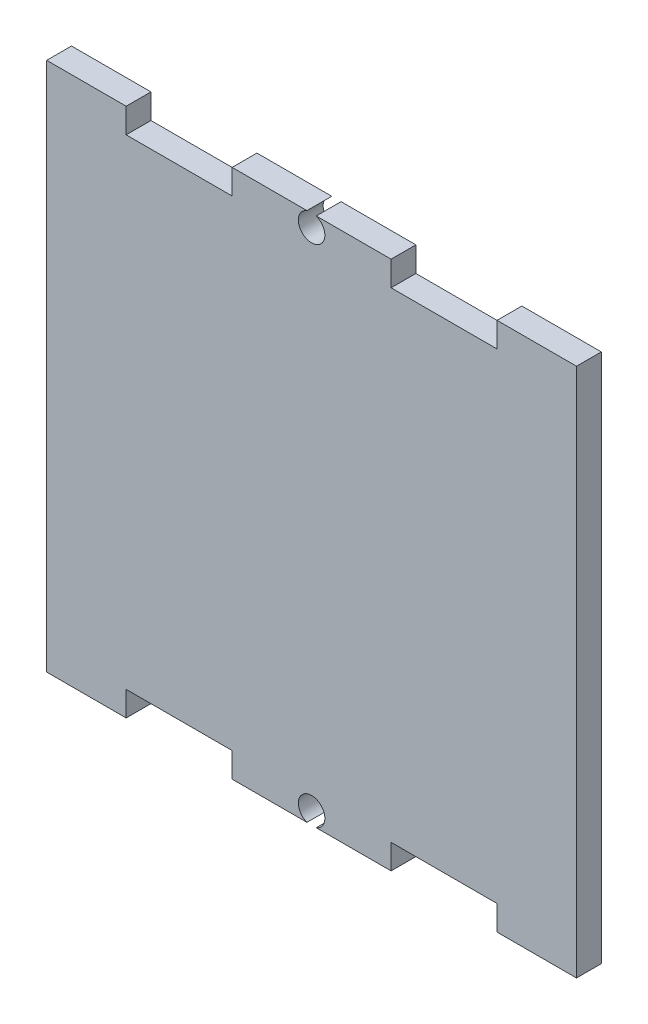
ISO-10303-21;
HEADER;
FILE_DESCRIPTION(('STEP AP214'),'2;1');
FILE_NAME('part.step','',(''),(''),'','','');
FILE_SCHEMA(('AUTOMOTIVE_DESIGN { 1 0 10303 214 1 1 1 1 }'));
ENDSEC;
DATA;
#1=APPLICATION_CONTEXT('core data for automotive mechanical design processes');
#2=APPLICATION_PROTOCOL_DEFINITION('international standard','automotive_design',2000,#1);
#3=PRODUCT_CONTEXT('',#1,'mechanical');
#4=PRODUCT('Part','Part','',(#3));
#5=PRODUCT_RELATED_PRODUCT_CATEGORY('part','',(#4));
#6=PRODUCT_DEFINITION_FORMATION('','',#4);
#7=PRODUCT_DEFINITION_CONTEXT('part definition',#1,'design');
#8=PRODUCT_DEFINITION('design','',#6,#7);
#9=PRODUCT_DEFINITION_SHAPE('','',#8);
#10=(LENGTH_UNIT() NAMED_UNIT(*) SI_UNIT(.MILLI.,.METRE.));
#11=(NAMED_UNIT(*) PLANE_ANGLE_UNIT() SI_UNIT($,.RADIAN.));
#12=(NAMED_UNIT(*) SI_UNIT($,.STERADIAN.) SOLID_ANGLE_UNIT());
#13=UNCERTAINTY_MEASURE_WITH_UNIT(LENGTH_MEASURE(1.E-05),#10,'distance_accuracy_value','');
#14=(GEOMETRIC_REPRESENTATION_CONTEXT(3) GLOBAL_UNCERTAINTY_ASSIGNED_CONTEXT((#13)) GLOBAL_UNIT_ASSIGNED_CONTEXT((#10,
#11,#12)) REPRESENTATION_CONTEXT('',''));
#15=CARTESIAN_POINT('',(0.,0.,0.));
#16=DIRECTION('',(0.,0.,1.));
#17=DIRECTION('',(1.,0.,0.));
#18=AXIS2_PLACEMENT_3D('',#15,#16,#17);
#19=CARTESIAN_POINT('',(-31.75,31.75,2.9718));
#20=DIRECTION('',(0.,-1.,0.));
#21=DIRECTION('',(0.,0.,-1.));
#22=AXIS2_PLACEMENT_3D('',#19,#20,#21);
#23=PLANE('',#22);
#24=DIRECTION('',(-1.,0.,0.));
#25=VECTOR('',#24,1.);
#26=CARTESIAN_POINT('',(-31.75,31.75,0.));
#27=LINE('',#26,#25);
#28=CARTESIAN_POINT('',(-0.5588,31.75,0.));
#29=VERTEX_POINT('',#28);
#30=CARTESIAN_POINT('',(-9.525,31.75,0.));
#31=VERTEX_POINT('',#30);
#32=EDGE_CURVE('E653',#29,#31,#27,.T.);
#33=ORIENTED_EDGE('',*,*,#32,.T.);
#34=DIRECTION('',(0.,0.,1.));
#35=VECTOR('',#34,1.);
#36=CARTESIAN_POINT('',(-9.525,31.75,0.));
#37=LINE('',#36,#35);
#38=CARTESIAN_POINT('',(-9.525,31.75,2.9718));
#39=VERTEX_POINT('',#38);
#40=EDGE_CURVE('E308',#31,#39,#37,.T.);
#41=ORIENTED_EDGE('',*,*,#40,.T.);
#42=DIRECTION('',(-1.,0.,0.));
#43=VECTOR('',#42,1.);
#44=CARTESIAN_POINT('',(-31.75,31.75,2.9718));
#45=LINE('',#44,#43);
#46=CARTESIAN_POINT('',(-0.5588,31.75,2.9718));
#47=VERTEX_POINT('',#46);
#48=EDGE_CURVE('E379',#47,#39,#45,.T.);
#49=ORIENTED_EDGE('',*,*,#48,.F.);
#50=DIRECTION('',(0.,0.,1.));
#51=VECTOR('',#50,1.);
#52=CARTESIAN_POINT('',(-0.5588,31.75,0.));
#53=LINE('',#52,#51);
#54=EDGE_CURVE('E261',#47,#29,#53,.F.);
#55=ORIENTED_EDGE('',*,*,#54,.T.);
#56=EDGE_LOOP('',(#33,#41,#49,#55));
#57=FACE_BOUND('',#56,.T.);
#58=ADVANCED_FACE('F33',(#57),#23,.F.);
#59=CARTESIAN_POINT('',(9.52500000000001,31.75,2.9718));
#60=VERTEX_POINT('',#59);
#61=CARTESIAN_POINT('',(0.5588,31.75,2.9718));
#62=VERTEX_POINT('',#61);
#63=EDGE_CURVE('E257',#60,#62,#45,.T.);
#64=ORIENTED_EDGE('',*,*,#63,.F.);
#65=DIRECTION('',(0.,0.,1.));
#66=VECTOR('',#65,1.);
#67=CARTESIAN_POINT('',(9.52500000000001,31.75,0.));
#68=LINE('',#67,#66);
#69=CARTESIAN_POINT('',(9.52500000000001,31.75,0.));
#70=VERTEX_POINT('',#69);
#71=EDGE_CURVE('E281',#70,#60,#68,.T.);
#72=ORIENTED_EDGE('',*,*,#71,.F.);
#73=CARTESIAN_POINT('',(0.5588,31.75,0.));
#74=VERTEX_POINT('',#73);
#75=EDGE_CURVE('E240',#70,#74,#27,.T.);
#76=ORIENTED_EDGE('',*,*,#75,.T.);
#77=DIRECTION('',(0.,0.,1.));
#78=VECTOR('',#77,1.);
#79=CARTESIAN_POINT('',(0.5588,31.75,0.));
#80=LINE('',#79,#78);
#81=EDGE_CURVE('E247',#74,#62,#80,.T.);
#82=ORIENTED_EDGE('',*,*,#81,.T.);
#83=EDGE_LOOP('',(#64,#72,#76,#82));
#84=FACE_BOUND('',#83,.T.);
#85=ADVANCED_FACE('F373',(#84),#23,.F.);
#86=CARTESIAN_POINT('',(31.75,31.75,0.));
#87=VERTEX_POINT('',#86);
#88=CARTESIAN_POINT('',(22.225,31.75,0.));
#89=VERTEX_POINT('',#88);
#90=EDGE_CURVE('E236',#87,#89,#27,.T.);
#91=ORIENTED_EDGE('',*,*,#90,.T.);
#92=DIRECTION('',(0.,0.,1.));
#93=VECTOR('',#92,1.);
#94=CARTESIAN_POINT('',(22.225,31.75,0.));
#95=LINE('',#94,#93);
#96=CARTESIAN_POINT('',(22.225,31.75,2.9718));
#97=VERTEX_POINT('',#96);
#98=EDGE_CURVE('E278',#89,#97,#95,.T.);
#99=ORIENTED_EDGE('',*,*,#98,.T.);
#100=CARTESIAN_POINT('',(31.75,31.75,2.9718));
#101=VERTEX_POINT('',#100);
#102=EDGE_CURVE('E255',#101,#97,#45,.T.);
#103=ORIENTED_EDGE('',*,*,#102,.F.);
#104=DIRECTION('',(0.,0.,-1.));
#105=VECTOR('',#104,1.);
#106=CARTESIAN_POINT('',(31.75,31.75,2.9718));
#107=LINE('',#106,#105);
#108=EDGE_CURVE('E391',#101,#87,#107,.T.);
#109=ORIENTED_EDGE('',*,*,#108,.T.);
#110=EDGE_LOOP('',(#91,#99,#103,#109));
#111=FACE_BOUND('',#110,.T.);
#112=ADVANCED_FACE('F417',(#111),#23,.F.);
#113=CARTESIAN_POINT('',(-31.75,-31.75,2.9718));
#114=DIRECTION('',(0.,1.,0.));
#115=DIRECTION('',(0.,0.,1.));
#116=AXIS2_PLACEMENT_3D('',#113,#114,#115);
#117=PLANE('',#116);
#118=DIRECTION('',(1.,0.,0.));
#119=VECTOR('',#118,1.);
#120=CARTESIAN_POINT('',(-31.75,-31.75,0.));
#121=LINE('',#120,#119);
#122=CARTESIAN_POINT('',(-31.75,-31.75,0.));
#123=VERTEX_POINT('',#122);
#124=CARTESIAN_POINT('',(-22.225,-31.75,0.));
#125=VERTEX_POINT('',#124);
#126=EDGE_CURVE('E209',#123,#125,#121,.T.);
#127=ORIENTED_EDGE('',*,*,#126,.T.);
#128=DIRECTION('',(0.,0.,1.));
#129=VECTOR('',#128,1.);
#130=CARTESIAN_POINT('',(-22.225,-31.75,0.));
#131=LINE('',#130,#129);
#132=CARTESIAN_POINT('',(-22.225,-31.75,2.9718));
#133=VERTEX_POINT('',#132);
#134=EDGE_CURVE('E193',#125,#133,#131,.T.);
#135=ORIENTED_EDGE('',*,*,#134,.T.);
#136=DIRECTION('',(1.,0.,0.));
#137=VECTOR('',#136,1.);
#138=CARTESIAN_POINT('',(-31.75,-31.75,2.9718));
#139=LINE('',#138,#137);
#140=CARTESIAN_POINT('',(-31.75,-31.75,2.9718));
#141=VERTEX_POINT('',#140);
#142=EDGE_CURVE('E248',#141,#133,#139,.T.);
#143=ORIENTED_EDGE('',*,*,#142,.F.);
#144=DIRECTION('',(0.,0.,-1.));
#145=VECTOR('',#144,1.);
#146=CARTESIAN_POINT('',(-31.75,-31.75,2.9718));
#147=LINE('',#146,#145);
#148=EDGE_CURVE('E217',#141,#123,#147,.T.);
#149=ORIENTED_EDGE('',*,*,#148,.T.);
#150=EDGE_LOOP('',(#127,#135,#143,#149));
#151=FACE_BOUND('',#150,.T.);
#152=ADVANCED_FACE('F215',(#151),#117,.F.);
#153=CARTESIAN_POINT('',(0.5588,-31.75,0.));
#154=VERTEX_POINT('',#153);
#155=CARTESIAN_POINT('',(9.52500000000001,-31.75,0.));
#156=VERTEX_POINT('',#155);
#157=EDGE_CURVE('E226',#154,#156,#121,.T.);
#158=ORIENTED_EDGE('',*,*,#157,.T.);
#159=DIRECTION('',(0.,0.,1.));
#160=VECTOR('',#159,1.);
#161=CARTESIAN_POINT('',(9.52500000000001,-31.75,0.));
#162=LINE('',#161,#160);
#163=CARTESIAN_POINT('',(9.52500000000001,-31.75,2.9718));
#164=VERTEX_POINT('',#163);
#165=EDGE_CURVE('E334',#156,#164,#162,.T.);
#166=ORIENTED_EDGE('',*,*,#165,.T.);
#167=CARTESIAN_POINT('',(0.5588,-31.75,2.9718));
#168=VERTEX_POINT('',#167);
#169=EDGE_CURVE('E421',#168,#164,#139,.T.);
#170=ORIENTED_EDGE('',*,*,#169,.F.);
#171=DIRECTION('',(0.,0.,1.));
#172=VECTOR('',#171,1.);
#173=CARTESIAN_POINT('',(0.5588,-31.75,0.));
#174=LINE('',#173,#172);
#175=EDGE_CURVE('E267',#168,#154,#174,.F.);
#176=ORIENTED_EDGE('',*,*,#175,.T.);
#177=EDGE_LOOP('',(#158,#166,#170,#176));
#178=FACE_BOUND('',#177,.T.);
#179=ADVANCED_FACE('F427',(#178),#117,.F.);
#180=CARTESIAN_POINT('',(-9.525,-31.75,2.9718));
#181=VERTEX_POINT('',#180);
#182=CARTESIAN_POINT('',(-0.5588,-31.75,2.9718));
#183=VERTEX_POINT('',#182);
#184=EDGE_CURVE('E251',#181,#183,#139,.T.);
#185=ORIENTED_EDGE('',*,*,#184,.F.);
#186=DIRECTION('',(0.,0.,1.));
#187=VECTOR('',#186,1.);
#188=CARTESIAN_POINT('',(-9.525,-31.75,0.));
#189=LINE('',#188,#187);
#190=CARTESIAN_POINT('',(-9.525,-31.75,0.));
#191=VERTEX_POINT('',#190);
#192=EDGE_CURVE('E203',#191,#181,#189,.T.);
#193=ORIENTED_EDGE('',*,*,#192,.F.);
#194=CARTESIAN_POINT('',(-0.5588,-31.75,0.));
#195=VERTEX_POINT('',#194);
#196=EDGE_CURVE('E219',#191,#195,#121,.T.);
#197=ORIENTED_EDGE('',*,*,#196,.T.);
#198=DIRECTION('',(0.,0.,1.));
#199=VECTOR('',#198,1.);
#200=CARTESIAN_POINT('',(-0.5588,-31.75,0.));
#201=LINE('',#200,#199);
#202=EDGE_CURVE('E264',#195,#183,#201,.T.);
#203=ORIENTED_EDGE('',*,*,#202,.T.);
#204=EDGE_LOOP('',(#185,#193,#197,#203));
#205=FACE_BOUND('',#204,.T.);
#206=ADVANCED_FACE('F405',(#205),#117,.F.);
#207=CARTESIAN_POINT('',(31.75,-31.75,2.9718));
#208=DIRECTION('',(-1.,0.,0.));
#209=DIRECTION('',(0.,0.,1.));
#210=AXIS2_PLACEMENT_3D('',#207,#208,#209);
#211=PLANE('',#210);
#212=DIRECTION('',(0.,1.,0.));
#213=VECTOR('',#212,1.);
#214=CARTESIAN_POINT('',(31.75,-31.75,0.));
#215=LINE('',#214,#213);
#216=CARTESIAN_POINT('',(31.75,-31.75,0.));
#217=VERTEX_POINT('',#216);
#218=EDGE_CURVE('E244',#217,#87,#215,.T.);
#219=ORIENTED_EDGE('',*,*,#218,.T.);
#220=ORIENTED_EDGE('',*,*,#108,.F.);
#221=DIRECTION('',(0.,1.,0.));
#222=VECTOR('',#221,1.);
#223=CARTESIAN_POINT('',(31.75,-31.75,2.9718));
#224=LINE('',#223,#222);
#225=CARTESIAN_POINT('',(31.75,-31.75,2.9718));
#226=VERTEX_POINT('',#225);
#227=EDGE_CURVE('E218',#226,#101,#224,.T.);
#228=ORIENTED_EDGE('',*,*,#227,.F.);
#229=DIRECTION('',(0.,0.,-1.));
#230=VECTOR('',#229,1.);
#231=CARTESIAN_POINT('',(31.75,-31.75,2.9718));
#232=LINE('',#231,#230);
#233=EDGE_CURVE('E250',#226,#217,#232,.T.);
#234=ORIENTED_EDGE('',*,*,#233,.T.);
#235=EDGE_LOOP('',(#219,#220,#228,#234));
#236=FACE_BOUND('',#235,.T.);
#237=ADVANCED_FACE('F35',(#236),#211,.F.);
#238=CARTESIAN_POINT('',(-22.225,31.75,2.9718));
#239=VERTEX_POINT('',#238);
#240=CARTESIAN_POINT('',(-31.75,31.75,2.9718));
#241=VERTEX_POINT('',#240);
#242=EDGE_CURVE('E223',#239,#241,#45,.T.);
#243=ORIENTED_EDGE('',*,*,#242,.F.);
#244=DIRECTION('',(0.,0.,1.));
#245=VECTOR('',#244,1.);
#246=CARTESIAN_POINT('',(-22.225,31.75,0.));
#247=LINE('',#246,#245);
#248=CARTESIAN_POINT('',(-22.225,31.75,0.));
#249=VERTEX_POINT('',#248);
#250=EDGE_CURVE('E301',#249,#239,#247,.T.);
#251=ORIENTED_EDGE('',*,*,#250,.F.);
#252=CARTESIAN_POINT('',(-31.75,31.75,0.));
#253=VERTEX_POINT('',#252);
#254=EDGE_CURVE('E242',#249,#253,#27,.T.);
#255=ORIENTED_EDGE('',*,*,#254,.T.);
#256=DIRECTION('',(0.,0.,-1.));
#257=VECTOR('',#256,1.);
#258=CARTESIAN_POINT('',(-31.75,31.75,2.9718));
#259=LINE('',#258,#257);
#260=EDGE_CURVE('E388',#241,#253,#259,.T.);
#261=ORIENTED_EDGE('',*,*,#260,.F.);
#262=EDGE_LOOP('',(#243,#251,#255,#261));
#263=FACE_BOUND('',#262,.T.);
#264=ADVANCED_FACE('F389',(#263),#23,.F.);
#265=CARTESIAN_POINT('',(-31.75,-31.75,2.9718));
#266=DIRECTION('',(1.,0.,0.));
#267=DIRECTION('',(0.,0.,-1.));
#268=AXIS2_PLACEMENT_3D('',#265,#266,#267);
#269=PLANE('',#268);
#270=DIRECTION('',(0.,-1.,0.));
#271=VECTOR('',#270,1.);
#272=CARTESIAN_POINT('',(-31.75,-31.75,0.));
#273=LINE('',#272,#271);
#274=EDGE_CURVE('E229',#253,#123,#273,.T.);
#275=ORIENTED_EDGE('',*,*,#274,.T.);
#276=ORIENTED_EDGE('',*,*,#148,.F.);
#277=DIRECTION('',(0.,-1.,0.));
#278=VECTOR('',#277,1.);
#279=CARTESIAN_POINT('',(-31.75,-31.75,2.9718));
#280=LINE('',#279,#278);
#281=EDGE_CURVE('E253',#241,#141,#280,.T.);
#282=ORIENTED_EDGE('',*,*,#281,.F.);
#283=ORIENTED_EDGE('',*,*,#260,.T.);
#284=EDGE_LOOP('',(#275,#276,#282,#283));
#285=FACE_BOUND('',#284,.T.);
#286=ADVANCED_FACE('F393',(#285),#269,.F.);
#287=CARTESIAN_POINT('',(22.225,-31.75,2.9718));
#288=VERTEX_POINT('',#287);
#289=EDGE_CURVE('E252',#288,#226,#139,.T.);
#290=ORIENTED_EDGE('',*,*,#289,.F.);
#291=DIRECTION('',(0.,0.,1.));
#292=VECTOR('',#291,1.);
#293=CARTESIAN_POINT('',(22.225,-31.75,0.));
#294=LINE('',#293,#292);
#295=CARTESIAN_POINT('',(22.225,-31.75,0.));
#296=VERTEX_POINT('',#295);
#297=EDGE_CURVE('E327',#296,#288,#294,.T.);
#298=ORIENTED_EDGE('',*,*,#297,.F.);
#299=EDGE_CURVE('E221',#296,#217,#121,.T.);
#300=ORIENTED_EDGE('',*,*,#299,.T.);
#301=ORIENTED_EDGE('',*,*,#233,.F.);
#302=EDGE_LOOP('',(#290,#298,#300,#301));
#303=FACE_BOUND('',#302,.T.);
#304=ADVANCED_FACE('F433',(#303),#117,.F.);
#305=CARTESIAN_POINT('',(0.,0.,2.9718));
#306=DIRECTION('',(0.,0.,-1.));
#307=DIRECTION('',(-1.,0.,0.));
#308=AXIS2_PLACEMENT_3D('',#305,#306,#307);
#309=PLANE('',#308);
#310=ORIENTED_EDGE('',*,*,#142,.T.);
#311=DIRECTION('',(0.,-1.,0.));
#312=VECTOR('',#311,1.);
#313=CARTESIAN_POINT('',(-22.225,-31.75,2.9718));
#314=LINE('',#313,#312);
#315=CARTESIAN_POINT('',(-22.225,-28.7782,2.9718));
#316=VERTEX_POINT('',#315);
#317=EDGE_CURVE('E198',#316,#133,#314,.T.);
#318=ORIENTED_EDGE('',*,*,#317,.F.);
#319=DIRECTION('',(-1.,0.,0.));
#320=VECTOR('',#319,1.);
#321=CARTESIAN_POINT('',(-22.225,-28.7782,2.9718));
#322=LINE('',#321,#320);
#323=CARTESIAN_POINT('',(-9.525,-28.7782,2.9718));
#324=VERTEX_POINT('',#323);
#325=EDGE_CURVE('E212',#324,#316,#322,.T.);
#326=ORIENTED_EDGE('',*,*,#325,.F.);
#327=DIRECTION('',(0.,1.,0.));
#328=VECTOR('',#327,1.);
#329=CARTESIAN_POINT('',(-9.525,-31.75,2.9718));
#330=LINE('',#329,#328);
#331=EDGE_CURVE('E356',#181,#324,#330,.T.);
#332=ORIENTED_EDGE('',*,*,#331,.F.);
#333=ORIENTED_EDGE('',*,*,#184,.T.);
#334=CARTESIAN_POINT('',(0.,-30.2641,2.9718));
#335=DIRECTION('',(0.,0.,1.));
#336=DIRECTION('',(1.,0.,0.));
#337=AXIS2_PLACEMENT_3D('',#334,#335,#336);
#338=CIRCLE('',#337,1.5875);
#339=EDGE_CURVE('E270',#168,#183,#338,.T.);
#340=ORIENTED_EDGE('',*,*,#339,.F.);
#341=ORIENTED_EDGE('',*,*,#169,.T.);
#342=DIRECTION('',(0.,-1.,0.));
#343=VECTOR('',#342,1.);
#344=CARTESIAN_POINT('',(9.52500000000001,-31.75,2.9718));
#345=LINE('',#344,#343);
#346=CARTESIAN_POINT('',(9.52500000000001,-28.7782,2.9718));
#347=VERTEX_POINT('',#346);
#348=EDGE_CURVE('E337',#347,#164,#345,.T.);
#349=ORIENTED_EDGE('',*,*,#348,.F.);
#350=DIRECTION('',(-1.,0.,0.));
#351=VECTOR('',#350,1.);
#352=CARTESIAN_POINT('',(9.52500000000001,-28.7782,2.9718));
#353=LINE('',#352,#351);
#354=CARTESIAN_POINT('',(22.225,-28.7782,2.9718));
#355=VERTEX_POINT('',#354);
#356=EDGE_CURVE('E340',#355,#347,#353,.T.);
#357=ORIENTED_EDGE('',*,*,#356,.F.);
#358=DIRECTION('',(0.,1.,0.));
#359=VECTOR('',#358,1.);
#360=CARTESIAN_POINT('',(22.225,-31.75,2.9718));
#361=LINE('',#360,#359);
#362=EDGE_CURVE('E311',#288,#355,#361,.T.);
#363=ORIENTED_EDGE('',*,*,#362,.F.);
#364=ORIENTED_EDGE('',*,*,#289,.T.);
#365=ORIENTED_EDGE('',*,*,#227,.T.);
#366=ORIENTED_EDGE('',*,*,#102,.T.);
#367=DIRECTION('',(0.,1.,0.));
#368=VECTOR('',#367,1.);
#369=CARTESIAN_POINT('',(22.225,31.75,2.9718));
#370=LINE('',#369,#368);
#371=CARTESIAN_POINT('',(22.225,28.7782,2.9718));
#372=VERTEX_POINT('',#371);
#373=EDGE_CURVE('E284',#372,#97,#370,.T.);
#374=ORIENTED_EDGE('',*,*,#373,.F.);
#375=DIRECTION('',(1.,0.,0.));
#376=VECTOR('',#375,1.);
#377=CARTESIAN_POINT('',(9.52500000000001,28.7782,2.9718));
#378=LINE('',#377,#376);
#379=CARTESIAN_POINT('',(9.52500000000001,28.7782,2.9718));
#380=VERTEX_POINT('',#379);
#381=EDGE_CURVE('E287',#380,#372,#378,.T.);
#382=ORIENTED_EDGE('',*,*,#381,.F.);
#383=DIRECTION('',(0.,-1.,0.));
#384=VECTOR('',#383,1.);
#385=CARTESIAN_POINT('',(9.52500000000001,31.75,2.9718));
#386=LINE('',#385,#384);
#387=EDGE_CURVE('E290',#60,#380,#386,.T.);
#388=ORIENTED_EDGE('',*,*,#387,.F.);
#389=ORIENTED_EDGE('',*,*,#63,.T.);
#390=CARTESIAN_POINT('',(0.,30.2641,2.9718));
#391=DIRECTION('',(0.,0.,1.));
#392=DIRECTION('',(-1.,0.,0.));
#393=AXIS2_PLACEMENT_3D('',#390,#391,#392);
#394=CIRCLE('',#393,1.5875);
#395=EDGE_CURVE('E293',#47,#62,#394,.T.);
#396=ORIENTED_EDGE('',*,*,#395,.F.);
#397=ORIENTED_EDGE('',*,*,#48,.T.);
#398=DIRECTION('',(0.,1.,0.));
#399=VECTOR('',#398,1.);
#400=CARTESIAN_POINT('',(-9.525,31.75,2.9718));
#401=LINE('',#400,#399);
#402=CARTESIAN_POINT('',(-9.525,28.7782,2.9718));
#403=VERTEX_POINT('',#402);
#404=EDGE_CURVE('E312',#403,#39,#401,.T.);
#405=ORIENTED_EDGE('',*,*,#404,.F.);
#406=DIRECTION('',(1.,0.,0.));
#407=VECTOR('',#406,1.);
#408=CARTESIAN_POINT('',(-22.225,28.7782,2.9718));
#409=LINE('',#408,#407);
#410=CARTESIAN_POINT('',(-22.225,28.7782,2.9718));
#411=VERTEX_POINT('',#410);
#412=EDGE_CURVE('E315',#411,#403,#409,.T.);
#413=ORIENTED_EDGE('',*,*,#412,.F.);
#414=DIRECTION('',(0.,-1.,0.));
#415=VECTOR('',#414,1.);
#416=CARTESIAN_POINT('',(-22.225,31.75,2.9718));
#417=LINE('',#416,#415);
#418=EDGE_CURVE('E283',#239,#411,#417,.T.);
#419=ORIENTED_EDGE('',*,*,#418,.F.);
#420=ORIENTED_EDGE('',*,*,#242,.T.);
#421=ORIENTED_EDGE('',*,*,#281,.T.);
#422=EDGE_LOOP('',(#310,#318,#326,#332,#333,#340,#341,#349,#357,#363,#364,#365,#366,#374,#382,
#388,#389,#396,#397,#405,#413,#419,#420,#421));
#423=FACE_BOUND('',#422,.T.);
#424=ADVANCED_FACE('F377',(#423),#309,.F.);
#425=CARTESIAN_POINT('',(0.,0.,0.));
#426=DIRECTION('',(0.,0.,-1.));
#427=DIRECTION('',(-1.,0.,0.));
#428=AXIS2_PLACEMENT_3D('',#425,#426,#427);
#429=PLANE('',#428);
#430=DIRECTION('',(0.,-1.,0.));
#431=VECTOR('',#430,1.);
#432=CARTESIAN_POINT('',(-22.225,-31.75,0.));
#433=LINE('',#432,#431);
#434=CARTESIAN_POINT('',(-22.225,-28.7782,0.));
#435=VERTEX_POINT('',#434);
#436=EDGE_CURVE('E196',#435,#125,#433,.T.);
#437=ORIENTED_EDGE('',*,*,#436,.T.);
#438=ORIENTED_EDGE('',*,*,#126,.F.);
#439=ORIENTED_EDGE('',*,*,#274,.F.);
#440=ORIENTED_EDGE('',*,*,#254,.F.);
#441=DIRECTION('',(0.,-1.,0.));
#442=VECTOR('',#441,1.);
#443=CARTESIAN_POINT('',(-22.225,31.75,0.));
#444=LINE('',#443,#442);
#445=CARTESIAN_POINT('',(-22.225,28.7782,0.));
#446=VERTEX_POINT('',#445);
#447=EDGE_CURVE('E314',#249,#446,#444,.T.);
#448=ORIENTED_EDGE('',*,*,#447,.T.);
#449=DIRECTION('',(1.,0.,0.));
#450=VECTOR('',#449,1.);
#451=CARTESIAN_POINT('',(-22.225,28.7782,0.));
#452=LINE('',#451,#450);
#453=CARTESIAN_POINT('',(-9.525,28.7782,0.));
#454=VERTEX_POINT('',#453);
#455=EDGE_CURVE('E322',#446,#454,#452,.T.);
#456=ORIENTED_EDGE('',*,*,#455,.T.);
#457=DIRECTION('',(0.,1.,0.));
#458=VECTOR('',#457,1.);
#459=CARTESIAN_POINT('',(-9.525,31.75,0.));
#460=LINE('',#459,#458);
#461=EDGE_CURVE('E304',#454,#31,#460,.T.);
#462=ORIENTED_EDGE('',*,*,#461,.T.);
#463=ORIENTED_EDGE('',*,*,#32,.F.);
#464=CARTESIAN_POINT('',(0.,30.2641,0.));
#465=DIRECTION('',(0.,0.,-1.));
#466=DIRECTION('',(-1.,0.,0.));
#467=AXIS2_PLACEMENT_3D('',#464,#465,#466);
#468=CIRCLE('',#467,1.5875);
#469=EDGE_CURVE('E11',#74,#29,#468,.T.);
#470=ORIENTED_EDGE('',*,*,#469,.F.);
#471=ORIENTED_EDGE('',*,*,#75,.F.);
#472=DIRECTION('',(0.,-1.,0.));
#473=VECTOR('',#472,1.);
#474=CARTESIAN_POINT('',(9.52500000000001,31.75,0.));
#475=LINE('',#474,#473);
#476=CARTESIAN_POINT('',(9.52500000000001,28.7782,0.));
#477=VERTEX_POINT('',#476);
#478=EDGE_CURVE('E286',#70,#477,#475,.T.);
#479=ORIENTED_EDGE('',*,*,#478,.T.);
#480=DIRECTION('',(1.,0.,0.));
#481=VECTOR('',#480,1.);
#482=CARTESIAN_POINT('',(9.52500000000001,28.7782,0.));
#483=LINE('',#482,#481);
#484=CARTESIAN_POINT('',(22.225,28.7782,0.));
#485=VERTEX_POINT('',#484);
#486=EDGE_CURVE('E296',#477,#485,#483,.T.);
#487=ORIENTED_EDGE('',*,*,#486,.T.);
#488=DIRECTION('',(0.,1.,0.));
#489=VECTOR('',#488,1.);
#490=CARTESIAN_POINT('',(22.225,31.75,0.));
#491=LINE('',#490,#489);
#492=EDGE_CURVE('E276',#485,#89,#491,.T.);
#493=ORIENTED_EDGE('',*,*,#492,.T.);
#494=ORIENTED_EDGE('',*,*,#90,.F.);
#495=ORIENTED_EDGE('',*,*,#218,.F.);
#496=ORIENTED_EDGE('',*,*,#299,.F.);
#497=DIRECTION('',(0.,1.,0.));
#498=VECTOR('',#497,1.);
#499=CARTESIAN_POINT('',(22.225,-31.75,0.));
#500=LINE('',#499,#498);
#501=CARTESIAN_POINT('',(22.225,-28.7782,0.));
#502=VERTEX_POINT('',#501);
#503=EDGE_CURVE('E339',#296,#502,#500,.T.);
#504=ORIENTED_EDGE('',*,*,#503,.T.);
#505=DIRECTION('',(-1.,0.,0.));
#506=VECTOR('',#505,1.);
#507=CARTESIAN_POINT('',(9.52500000000001,-28.7782,0.));
#508=LINE('',#507,#506);
#509=CARTESIAN_POINT('',(9.52500000000001,-28.7782,0.));
#510=VERTEX_POINT('',#509);
#511=EDGE_CURVE('E56',#502,#510,#508,.T.);
#512=ORIENTED_EDGE('',*,*,#511,.T.);
#513=DIRECTION('',(0.,-1.,0.));
#514=VECTOR('',#513,1.);
#515=CARTESIAN_POINT('',(9.52500000000001,-31.75,0.));
#516=LINE('',#515,#514);
#517=EDGE_CURVE('E330',#510,#156,#516,.T.);
#518=ORIENTED_EDGE('',*,*,#517,.T.);
#519=ORIENTED_EDGE('',*,*,#157,.F.);
#520=CARTESIAN_POINT('',(0.,-30.2641,0.));
#521=DIRECTION('',(0.,0.,-1.));
#522=DIRECTION('',(-1.,0.,0.));
#523=AXIS2_PLACEMENT_3D('',#520,#521,#522);
#524=CIRCLE('',#523,1.5875);
#525=EDGE_CURVE('E41',#195,#154,#524,.T.);
#526=ORIENTED_EDGE('',*,*,#525,.F.);
#527=ORIENTED_EDGE('',*,*,#196,.F.);
#528=DIRECTION('',(0.,1.,0.));
#529=VECTOR('',#528,1.);
#530=CARTESIAN_POINT('',(-9.525,-31.75,0.));
#531=LINE('',#530,#529);
#532=CARTESIAN_POINT('',(-9.525,-28.7782,0.));
#533=VERTEX_POINT('',#532);
#534=EDGE_CURVE('E211',#191,#533,#531,.T.);
#535=ORIENTED_EDGE('',*,*,#534,.T.);
#536=DIRECTION('',(-1.,0.,0.));
#537=VECTOR('',#536,1.);
#538=CARTESIAN_POINT('',(-22.225,-28.7782,0.));
#539=LINE('',#538,#537);
#540=EDGE_CURVE('E48',#533,#435,#539,.T.);
#541=ORIENTED_EDGE('',*,*,#540,.T.);
#542=EDGE_LOOP('',(#437,#438,#439,#440,#448,#456,#462,#463,#470,#471,#479,#487,#493,#494,#495,
#496,#504,#512,#518,#519,#526,#527,#535,#541));
#543=FACE_BOUND('',#542,.T.);
#544=ADVANCED_FACE('F207',(#543),#429,.T.);
#545=CARTESIAN_POINT('',(0.,-30.2641,0.));
#546=DIRECTION('',(0.,0.,1.));
#547=DIRECTION('',(1.,0.,0.));
#548=AXIS2_PLACEMENT_3D('',#545,#546,#547);
#549=CYLINDRICAL_SURFACE('',#548,1.5875);
#550=ORIENTED_EDGE('',*,*,#525,.T.);
#551=ORIENTED_EDGE('',*,*,#175,.F.);
#552=ORIENTED_EDGE('',*,*,#339,.T.);
#553=ORIENTED_EDGE('',*,*,#202,.F.);
#554=EDGE_LOOP('',(#550,#551,#552,#553));
#555=FACE_BOUND('',#554,.T.);
#556=ADVANCED_FACE('F512',(#555),#549,.F.);
#557=CARTESIAN_POINT('',(0.,30.2641,0.));
#558=DIRECTION('',(0.,0.,1.));
#559=DIRECTION('',(1.,0.,0.));
#560=AXIS2_PLACEMENT_3D('',#557,#558,#559);
#561=CYLINDRICAL_SURFACE('',#560,1.5875);
#562=ORIENTED_EDGE('',*,*,#469,.T.);
#563=ORIENTED_EDGE('',*,*,#54,.F.);
#564=ORIENTED_EDGE('',*,*,#395,.T.);
#565=ORIENTED_EDGE('',*,*,#81,.F.);
#566=EDGE_LOOP('',(#562,#563,#564,#565));
#567=FACE_BOUND('',#566,.T.);
#568=ADVANCED_FACE('F364',(#567),#561,.F.);
#569=CARTESIAN_POINT('',(9.52500000000001,31.75,0.));
#570=DIRECTION('',(-1.,0.,0.));
#571=DIRECTION('',(0.,0.,1.));
#572=AXIS2_PLACEMENT_3D('',#569,#570,#571);
#573=PLANE('',#572);
#574=ORIENTED_EDGE('',*,*,#387,.T.);
#575=DIRECTION('',(0.,0.,1.));
#576=VECTOR('',#575,1.);
#577=CARTESIAN_POINT('',(9.52500000000001,28.7782,0.));
#578=LINE('',#577,#576);
#579=EDGE_CURVE('E273',#477,#380,#578,.T.);
#580=ORIENTED_EDGE('',*,*,#579,.F.);
#581=ORIENTED_EDGE('',*,*,#478,.F.);
#582=ORIENTED_EDGE('',*,*,#71,.T.);
#583=EDGE_LOOP('',(#574,#580,#581,#582));
#584=FACE_BOUND('',#583,.T.);
#585=ADVANCED_FACE('F535',(#584),#573,.F.);
#586=CARTESIAN_POINT('',(22.225,31.75,0.));
#587=DIRECTION('',(1.,0.,0.));
#588=DIRECTION('',(0.,0.,-1.));
#589=AXIS2_PLACEMENT_3D('',#586,#587,#588);
#590=PLANE('',#589);
#591=ORIENTED_EDGE('',*,*,#373,.T.);
#592=ORIENTED_EDGE('',*,*,#98,.F.);
#593=ORIENTED_EDGE('',*,*,#492,.F.);
#594=DIRECTION('',(0.,0.,1.));
#595=VECTOR('',#594,1.);
#596=CARTESIAN_POINT('',(22.225,28.7782,0.));
#597=LINE('',#596,#595);
#598=EDGE_CURVE('E275',#485,#372,#597,.T.);
#599=ORIENTED_EDGE('',*,*,#598,.T.);
#600=EDGE_LOOP('',(#591,#592,#593,#599));
#601=FACE_BOUND('',#600,.T.);
#602=ADVANCED_FACE('F542',(#601),#590,.F.);
#603=CARTESIAN_POINT('',(9.52500000000001,28.7782,0.));
#604=DIRECTION('',(0.,-1.,0.));
#605=DIRECTION('',(0.,0.,-1.));
#606=AXIS2_PLACEMENT_3D('',#603,#604,#605);
#607=PLANE('',#606);
#608=ORIENTED_EDGE('',*,*,#381,.T.);
#609=ORIENTED_EDGE('',*,*,#598,.F.);
#610=ORIENTED_EDGE('',*,*,#486,.F.);
#611=ORIENTED_EDGE('',*,*,#579,.T.);
#612=EDGE_LOOP('',(#608,#609,#610,#611));
#613=FACE_BOUND('',#612,.T.);
#614=ADVANCED_FACE('F550',(#613),#607,.F.);
#615=CARTESIAN_POINT('',(-9.525,31.75,0.));
#616=DIRECTION('',(1.,0.,0.));
#617=DIRECTION('',(0.,0.,-1.));
#618=AXIS2_PLACEMENT_3D('',#615,#616,#617);
#619=PLANE('',#618);
#620=ORIENTED_EDGE('',*,*,#404,.T.);
#621=ORIENTED_EDGE('',*,*,#40,.F.);
#622=ORIENTED_EDGE('',*,*,#461,.F.);
#623=DIRECTION('',(0.,0.,1.));
#624=VECTOR('',#623,1.);
#625=CARTESIAN_POINT('',(-9.525,28.7782,0.));
#626=LINE('',#625,#624);
#627=EDGE_CURVE('E306',#454,#403,#626,.T.);
#628=ORIENTED_EDGE('',*,*,#627,.T.);
#629=EDGE_LOOP('',(#620,#621,#622,#628));
#630=FACE_BOUND('',#629,.T.);
#631=ADVANCED_FACE('F558',(#630),#619,.F.);
#632=CARTESIAN_POINT('',(-22.225,28.7782,0.));
#633=DIRECTION('',(0.,-1.,0.));
#634=DIRECTION('',(0.,0.,-1.));
#635=AXIS2_PLACEMENT_3D('',#632,#633,#634);
#636=PLANE('',#635);
#637=ORIENTED_EDGE('',*,*,#412,.T.);
#638=ORIENTED_EDGE('',*,*,#627,.F.);
#639=ORIENTED_EDGE('',*,*,#455,.F.);
#640=DIRECTION('',(0.,0.,1.));
#641=VECTOR('',#640,1.);
#642=CARTESIAN_POINT('',(-22.225,28.7782,0.));
#643=LINE('',#642,#641);
#644=EDGE_CURVE('E303',#446,#411,#643,.T.);
#645=ORIENTED_EDGE('',*,*,#644,.T.);
#646=EDGE_LOOP('',(#637,#638,#639,#645));
#647=FACE_BOUND('',#646,.T.);
#648=ADVANCED_FACE('F566',(#647),#636,.F.);
#649=CARTESIAN_POINT('',(-22.225,31.75,0.));
#650=DIRECTION('',(-1.,0.,0.));
#651=DIRECTION('',(0.,0.,1.));
#652=AXIS2_PLACEMENT_3D('',#649,#650,#651);
#653=PLANE('',#652);
#654=ORIENTED_EDGE('',*,*,#418,.T.);
#655=ORIENTED_EDGE('',*,*,#644,.F.);
#656=ORIENTED_EDGE('',*,*,#447,.F.);
#657=ORIENTED_EDGE('',*,*,#250,.T.);
#658=EDGE_LOOP('',(#654,#655,#656,#657));
#659=FACE_BOUND('',#658,.T.);
#660=ADVANCED_FACE('F574',(#659),#653,.F.);
#661=CARTESIAN_POINT('',(9.52500000000001,-31.75,0.));
#662=DIRECTION('',(-1.,0.,0.));
#663=DIRECTION('',(0.,0.,1.));
#664=AXIS2_PLACEMENT_3D('',#661,#662,#663);
#665=PLANE('',#664);
#666=ORIENTED_EDGE('',*,*,#348,.T.);
#667=ORIENTED_EDGE('',*,*,#165,.F.);
#668=ORIENTED_EDGE('',*,*,#517,.F.);
#669=DIRECTION('',(0.,0.,1.));
#670=VECTOR('',#669,1.);
#671=CARTESIAN_POINT('',(9.52500000000001,-28.7782,0.));
#672=LINE('',#671,#670);
#673=EDGE_CURVE('E332',#510,#347,#672,.T.);
#674=ORIENTED_EDGE('',*,*,#673,.T.);
#675=EDGE_LOOP('',(#666,#667,#668,#674));
#676=FACE_BOUND('',#675,.T.);
#677=ADVANCED_FACE('F430',(#676),#665,.F.);
#678=CARTESIAN_POINT('',(9.52500000000001,-28.7782,0.));
#679=DIRECTION('',(0.,1.,0.));
#680=DIRECTION('',(0.,0.,1.));
#681=AXIS2_PLACEMENT_3D('',#678,#679,#680);
#682=PLANE('',#681);
#683=ORIENTED_EDGE('',*,*,#356,.T.);
#684=ORIENTED_EDGE('',*,*,#673,.F.);
#685=ORIENTED_EDGE('',*,*,#511,.F.);
#686=DIRECTION('',(0.,0.,1.));
#687=VECTOR('',#686,1.);
#688=CARTESIAN_POINT('',(22.225,-28.7782,0.));
#689=LINE('',#688,#687);
#690=EDGE_CURVE('E329',#502,#355,#689,.T.);
#691=ORIENTED_EDGE('',*,*,#690,.T.);
#692=EDGE_LOOP('',(#683,#684,#685,#691));
#693=FACE_BOUND('',#692,.T.);
#694=ADVANCED_FACE('F589',(#693),#682,.F.);
#695=CARTESIAN_POINT('',(22.225,-31.75,0.));
#696=DIRECTION('',(1.,0.,0.));
#697=DIRECTION('',(0.,0.,-1.));
#698=AXIS2_PLACEMENT_3D('',#695,#696,#697);
#699=PLANE('',#698);
#700=ORIENTED_EDGE('',*,*,#362,.T.);
#701=ORIENTED_EDGE('',*,*,#690,.F.);
#702=ORIENTED_EDGE('',*,*,#503,.F.);
#703=ORIENTED_EDGE('',*,*,#297,.T.);
#704=EDGE_LOOP('',(#700,#701,#702,#703));
#705=FACE_BOUND('',#704,.T.);
#706=ADVANCED_FACE('F432',(#705),#699,.F.);
#707=CARTESIAN_POINT('',(-22.225,-31.75,0.));
#708=DIRECTION('',(-1.,0.,0.));
#709=DIRECTION('',(0.,0.,1.));
#710=AXIS2_PLACEMENT_3D('',#707,#708,#709);
#711=PLANE('',#710);
#712=ORIENTED_EDGE('',*,*,#317,.T.);
#713=ORIENTED_EDGE('',*,*,#134,.F.);
#714=ORIENTED_EDGE('',*,*,#436,.F.);
#715=DIRECTION('',(0.,0.,1.));
#716=VECTOR('',#715,1.);
#717=CARTESIAN_POINT('',(-22.225,-28.7782,0.));
#718=LINE('',#717,#716);
#719=EDGE_CURVE('E272',#435,#316,#718,.T.);
#720=ORIENTED_EDGE('',*,*,#719,.T.);
#721=EDGE_LOOP('',(#712,#713,#714,#720));
#722=FACE_BOUND('',#721,.T.);
#723=ADVANCED_FACE('F195',(#722),#711,.F.);
#724=CARTESIAN_POINT('',(-22.225,-28.7782,0.));
#725=DIRECTION('',(0.,1.,0.));
#726=DIRECTION('',(0.,0.,1.));
#727=AXIS2_PLACEMENT_3D('',#724,#725,#726);
#728=PLANE('',#727);
#729=ORIENTED_EDGE('',*,*,#325,.T.);
#730=ORIENTED_EDGE('',*,*,#719,.F.);
#731=ORIENTED_EDGE('',*,*,#540,.F.);
#732=DIRECTION('',(0.,0.,1.));
#733=VECTOR('',#732,1.);
#734=CARTESIAN_POINT('',(-9.525,-28.7782,0.));
#735=LINE('',#734,#733);
#736=EDGE_CURVE('E351',#533,#324,#735,.T.);
#737=ORIENTED_EDGE('',*,*,#736,.T.);
#738=EDGE_LOOP('',(#729,#730,#731,#737));
#739=FACE_BOUND('',#738,.T.);
#740=ADVANCED_FACE('F399',(#739),#728,.F.);
#741=CARTESIAN_POINT('',(-9.525,-31.75,0.));
#742=DIRECTION('',(1.,0.,0.));
#743=DIRECTION('',(0.,0.,-1.));
#744=AXIS2_PLACEMENT_3D('',#741,#742,#743);
#745=PLANE('',#744);
#746=ORIENTED_EDGE('',*,*,#331,.T.);
#747=ORIENTED_EDGE('',*,*,#736,.F.);
#748=ORIENTED_EDGE('',*,*,#534,.F.);
#749=ORIENTED_EDGE('',*,*,#192,.T.);
#750=EDGE_LOOP('',(#746,#747,#748,#749));
#751=FACE_BOUND('',#750,.T.);
#752=ADVANCED_FACE('F401',(#751),#745,.F.);
#753=CLOSED_SHELL('',(#58,#85,#112,#152,#179,#206,#237,#264,#286,#304,#424,#544,#556,#568,#585,
#602,#614,#631,#648,#660,#677,#694,#706,#723,#740,#752));
#754=MANIFOLD_SOLID_BREP('B2',#753);
#755=ADVANCED_BREP_SHAPE_REPRESENTATION('',(#18,#754),#14);
#756=SHAPE_DEFINITION_REPRESENTATION(#9,#755);
ENDSEC;
END-ISO-10303-21;
